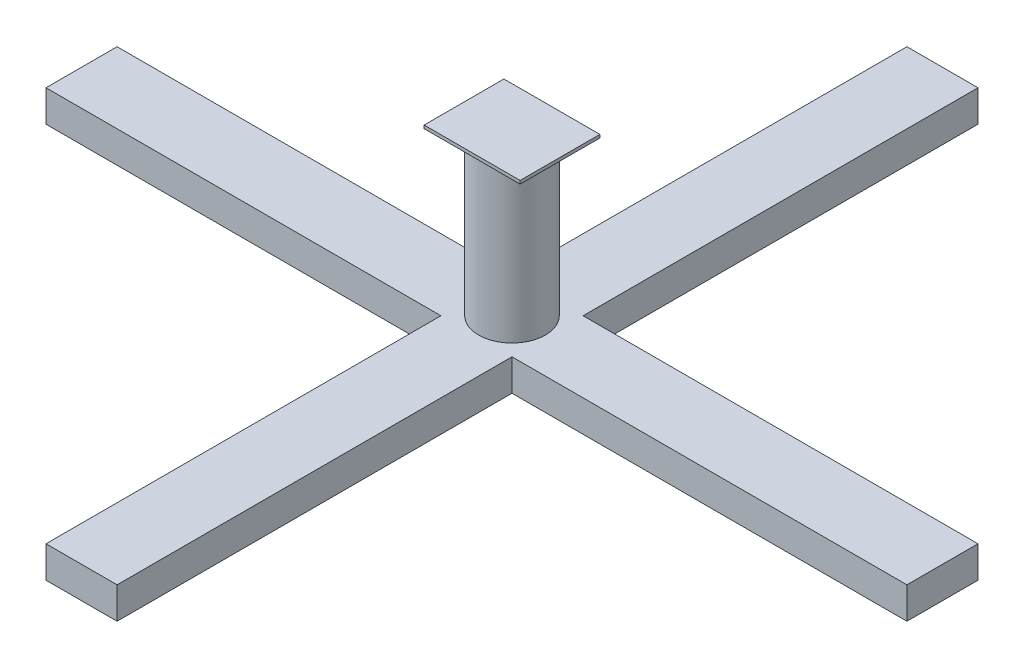
ISO-10303-21;
HEADER;
FILE_DESCRIPTION(('STEP AP214'),'2;1');
FILE_NAME('part.step','',(''),(''),'','','');
FILE_SCHEMA(('AUTOMOTIVE_DESIGN { 1 0 10303 214 1 1 1 1 }'));
ENDSEC;
DATA;
#1=APPLICATION_CONTEXT('core data for automotive mechanical design processes');
#2=APPLICATION_PROTOCOL_DEFINITION('international standard','automotive_design',2000,#1);
#3=PRODUCT_CONTEXT('',#1,'mechanical');
#4=PRODUCT('Part','Part','',(#3));
#5=PRODUCT_RELATED_PRODUCT_CATEGORY('part','',(#4));
#6=PRODUCT_DEFINITION_FORMATION('','',#4);
#7=PRODUCT_DEFINITION_CONTEXT('part definition',#1,'design');
#8=PRODUCT_DEFINITION('design','',#6,#7);
#9=PRODUCT_DEFINITION_SHAPE('','',#8);
#10=(LENGTH_UNIT() NAMED_UNIT(*) SI_UNIT(.MILLI.,.METRE.));
#11=(NAMED_UNIT(*) PLANE_ANGLE_UNIT() SI_UNIT($,.RADIAN.));
#12=(NAMED_UNIT(*) SI_UNIT($,.STERADIAN.) SOLID_ANGLE_UNIT());
#13=UNCERTAINTY_MEASURE_WITH_UNIT(LENGTH_MEASURE(1.E-05),#10,'distance_accuracy_value','');
#14=(GEOMETRIC_REPRESENTATION_CONTEXT(3) GLOBAL_UNCERTAINTY_ASSIGNED_CONTEXT((#13)) GLOBAL_UNIT_ASSIGNED_CONTEXT((#10,
#11,#12)) REPRESENTATION_CONTEXT('',''));
#15=CARTESIAN_POINT('',(0.,0.,0.));
#16=DIRECTION('',(0.,0.,1.));
#17=DIRECTION('',(1.,0.,0.));
#18=AXIS2_PLACEMENT_3D('',#15,#16,#17);
#19=CARTESIAN_POINT('',(-545.,40.,0.));
#20=DIRECTION('',(-1.,0.,0.));
#21=DIRECTION('',(0.,0.,1.));
#22=AXIS2_PLACEMENT_3D('',#19,#20,#21);
#23=PLANE('',#22);
#24=DIRECTION('',(0.,0.,-1.));
#25=VECTOR('',#24,1.);
#26=CARTESIAN_POINT('',(-545.,0.,0.));
#27=LINE('',#26,#25);
#28=CARTESIAN_POINT('',(-545.,0.,45.));
#29=VERTEX_POINT('',#28);
#30=CARTESIAN_POINT('',(-545.,0.,-45.));
#31=VERTEX_POINT('',#30);
#32=EDGE_CURVE('E172',#29,#31,#27,.T.);
#33=ORIENTED_EDGE('',*,*,#32,.F.);
#34=DIRECTION('',(0.,-1.,0.));
#35=VECTOR('',#34,1.);
#36=CARTESIAN_POINT('',(-545.,40.,45.));
#37=LINE('',#36,#35);
#38=CARTESIAN_POINT('',(-545.,40.,45.));
#39=VERTEX_POINT('',#38);
#40=EDGE_CURVE('E112',#39,#29,#37,.T.);
#41=ORIENTED_EDGE('',*,*,#40,.F.);
#42=DIRECTION('',(0.,0.,-1.));
#43=VECTOR('',#42,1.);
#44=CARTESIAN_POINT('',(-545.,40.,0.));
#45=LINE('',#44,#43);
#46=CARTESIAN_POINT('',(-545.,40.,-45.));
#47=VERTEX_POINT('',#46);
#48=EDGE_CURVE('E215',#39,#47,#45,.T.);
#49=ORIENTED_EDGE('',*,*,#48,.T.);
#50=DIRECTION('',(0.,-1.,0.));
#51=VECTOR('',#50,1.);
#52=CARTESIAN_POINT('',(-545.,40.,-45.));
#53=LINE('',#52,#51);
#54=EDGE_CURVE('E108',#47,#31,#53,.T.);
#55=ORIENTED_EDGE('',*,*,#54,.T.);
#56=EDGE_LOOP('',(#33,#41,#49,#55));
#57=FACE_BOUND('',#56,.T.);
#58=ADVANCED_FACE('F42',(#57),#23,.T.);
#59=CARTESIAN_POINT('',(0.,40.,45.));
#60=DIRECTION('',(0.,0.,1.));
#61=DIRECTION('',(1.,0.,0.));
#62=AXIS2_PLACEMENT_3D('',#59,#60,#61);
#63=PLANE('',#62);
#64=DIRECTION('',(-1.,0.,0.));
#65=VECTOR('',#64,1.);
#66=CARTESIAN_POINT('',(0.,0.,45.));
#67=LINE('',#66,#65);
#68=CARTESIAN_POINT('',(-45.,0.,45.));
#69=VERTEX_POINT('',#68);
#70=EDGE_CURVE('E176',#69,#29,#67,.T.);
#71=ORIENTED_EDGE('',*,*,#70,.F.);
#72=DIRECTION('',(0.,-1.,0.));
#73=VECTOR('',#72,1.);
#74=CARTESIAN_POINT('',(-45.,40.,45.));
#75=LINE('',#74,#73);
#76=CARTESIAN_POINT('',(-45.,40.,45.));
#77=VERTEX_POINT('',#76);
#78=EDGE_CURVE('E241',#77,#69,#75,.T.);
#79=ORIENTED_EDGE('',*,*,#78,.F.);
#80=DIRECTION('',(-1.,0.,0.));
#81=VECTOR('',#80,1.);
#82=CARTESIAN_POINT('',(0.,40.,45.));
#83=LINE('',#82,#81);
#84=EDGE_CURVE('E332',#77,#39,#83,.T.);
#85=ORIENTED_EDGE('',*,*,#84,.T.);
#86=ORIENTED_EDGE('',*,*,#40,.T.);
#87=EDGE_LOOP('',(#71,#79,#85,#86));
#88=FACE_BOUND('',#87,.T.);
#89=ADVANCED_FACE('F313',(#88),#63,.T.);
#90=CARTESIAN_POINT('',(-45.,40.,0.));
#91=DIRECTION('',(1.,0.,0.));
#92=DIRECTION('',(0.,0.,-1.));
#93=AXIS2_PLACEMENT_3D('',#90,#91,#92);
#94=PLANE('',#93);
#95=DIRECTION('',(0.,0.,1.));
#96=VECTOR('',#95,1.);
#97=CARTESIAN_POINT('',(-45.,0.,0.));
#98=LINE('',#97,#96);
#99=CARTESIAN_POINT('',(-45.,0.,545.));
#100=VERTEX_POINT('',#99);
#101=EDGE_CURVE('E181',#69,#100,#98,.T.);
#102=ORIENTED_EDGE('',*,*,#101,.T.);
#103=DIRECTION('',(0.,-1.,0.));
#104=VECTOR('',#103,1.);
#105=CARTESIAN_POINT('',(-45.,40.,545.));
#106=LINE('',#105,#104);
#107=CARTESIAN_POINT('',(-45.,40.,545.));
#108=VERTEX_POINT('',#107);
#109=EDGE_CURVE('E238',#108,#100,#106,.T.);
#110=ORIENTED_EDGE('',*,*,#109,.F.);
#111=DIRECTION('',(0.,0.,1.));
#112=VECTOR('',#111,1.);
#113=CARTESIAN_POINT('',(-45.,40.,0.));
#114=LINE('',#113,#112);
#115=EDGE_CURVE('E327',#77,#108,#114,.T.);
#116=ORIENTED_EDGE('',*,*,#115,.F.);
#117=ORIENTED_EDGE('',*,*,#78,.T.);
#118=EDGE_LOOP('',(#102,#110,#116,#117));
#119=FACE_BOUND('',#118,.T.);
#120=ADVANCED_FACE('F310',(#119),#94,.F.);
#121=CARTESIAN_POINT('',(0.,40.,545.));
#122=DIRECTION('',(0.,0.,1.));
#123=DIRECTION('',(1.,0.,0.));
#124=AXIS2_PLACEMENT_3D('',#121,#122,#123);
#125=PLANE('',#124);
#126=DIRECTION('',(-1.,0.,0.));
#127=VECTOR('',#126,1.);
#128=CARTESIAN_POINT('',(0.,0.,545.));
#129=LINE('',#128,#127);
#130=CARTESIAN_POINT('',(45.,0.,545.));
#131=VERTEX_POINT('',#130);
#132=EDGE_CURVE('E185',#131,#100,#129,.T.);
#133=ORIENTED_EDGE('',*,*,#132,.F.);
#134=DIRECTION('',(0.,-1.,0.));
#135=VECTOR('',#134,1.);
#136=CARTESIAN_POINT('',(45.,40.,545.));
#137=LINE('',#136,#135);
#138=CARTESIAN_POINT('',(45.,40.,545.));
#139=VERTEX_POINT('',#138);
#140=EDGE_CURVE('E235',#139,#131,#137,.T.);
#141=ORIENTED_EDGE('',*,*,#140,.F.);
#142=DIRECTION('',(-1.,0.,0.));
#143=VECTOR('',#142,1.);
#144=CARTESIAN_POINT('',(0.,40.,545.));
#145=LINE('',#144,#143);
#146=EDGE_CURVE('E331',#139,#108,#145,.T.);
#147=ORIENTED_EDGE('',*,*,#146,.T.);
#148=ORIENTED_EDGE('',*,*,#109,.T.);
#149=EDGE_LOOP('',(#133,#141,#147,#148));
#150=FACE_BOUND('',#149,.T.);
#151=ADVANCED_FACE('F306',(#150),#125,.T.);
#152=CARTESIAN_POINT('',(45.,40.,0.));
#153=DIRECTION('',(1.,0.,0.));
#154=DIRECTION('',(0.,0.,-1.));
#155=AXIS2_PLACEMENT_3D('',#152,#153,#154);
#156=PLANE('',#155);
#157=DIRECTION('',(0.,0.,1.));
#158=VECTOR('',#157,1.);
#159=CARTESIAN_POINT('',(45.,0.,0.));
#160=LINE('',#159,#158);
#161=CARTESIAN_POINT('',(45.,0.,45.));
#162=VERTEX_POINT('',#161);
#163=EDGE_CURVE('E189',#162,#131,#160,.T.);
#164=ORIENTED_EDGE('',*,*,#163,.F.);
#165=DIRECTION('',(0.,-1.,0.));
#166=VECTOR('',#165,1.);
#167=CARTESIAN_POINT('',(45.,40.,45.));
#168=LINE('',#167,#166);
#169=CARTESIAN_POINT('',(45.,40.,45.));
#170=VERTEX_POINT('',#169);
#171=EDGE_CURVE('E232',#170,#162,#168,.T.);
#172=ORIENTED_EDGE('',*,*,#171,.F.);
#173=DIRECTION('',(0.,0.,1.));
#174=VECTOR('',#173,1.);
#175=CARTESIAN_POINT('',(45.,40.,0.));
#176=LINE('',#175,#174);
#177=EDGE_CURVE('E342',#170,#139,#176,.T.);
#178=ORIENTED_EDGE('',*,*,#177,.T.);
#179=ORIENTED_EDGE('',*,*,#140,.T.);
#180=EDGE_LOOP('',(#164,#172,#178,#179));
#181=FACE_BOUND('',#180,.T.);
#182=ADVANCED_FACE('F302',(#181),#156,.T.);
#183=CARTESIAN_POINT('',(0.,40.,45.));
#184=DIRECTION('',(0.,0.,-1.));
#185=DIRECTION('',(-1.,0.,0.));
#186=AXIS2_PLACEMENT_3D('',#183,#184,#185);
#187=PLANE('',#186);
#188=DIRECTION('',(1.,0.,0.));
#189=VECTOR('',#188,1.);
#190=CARTESIAN_POINT('',(0.,0.,45.));
#191=LINE('',#190,#189);
#192=CARTESIAN_POINT('',(545.,0.,45.));
#193=VERTEX_POINT('',#192);
#194=EDGE_CURVE('E193',#162,#193,#191,.T.);
#195=ORIENTED_EDGE('',*,*,#194,.T.);
#196=DIRECTION('',(0.,-1.,0.));
#197=VECTOR('',#196,1.);
#198=CARTESIAN_POINT('',(545.,40.,45.));
#199=LINE('',#198,#197);
#200=CARTESIAN_POINT('',(545.,40.,45.));
#201=VERTEX_POINT('',#200);
#202=EDGE_CURVE('E228',#201,#193,#199,.T.);
#203=ORIENTED_EDGE('',*,*,#202,.F.);
#204=DIRECTION('',(1.,0.,0.));
#205=VECTOR('',#204,1.);
#206=CARTESIAN_POINT('',(0.,40.,45.));
#207=LINE('',#206,#205);
#208=EDGE_CURVE('E346',#170,#201,#207,.T.);
#209=ORIENTED_EDGE('',*,*,#208,.F.);
#210=ORIENTED_EDGE('',*,*,#171,.T.);
#211=EDGE_LOOP('',(#195,#203,#209,#210));
#212=FACE_BOUND('',#211,.T.);
#213=ADVANCED_FACE('F298',(#212),#187,.F.);
#214=CARTESIAN_POINT('',(545.,40.,0.));
#215=DIRECTION('',(-1.,0.,0.));
#216=DIRECTION('',(0.,0.,1.));
#217=AXIS2_PLACEMENT_3D('',#214,#215,#216);
#218=PLANE('',#217);
#219=DIRECTION('',(0.,0.,-1.));
#220=VECTOR('',#219,1.);
#221=CARTESIAN_POINT('',(545.,0.,0.));
#222=LINE('',#221,#220);
#223=CARTESIAN_POINT('',(545.,0.,-45.));
#224=VERTEX_POINT('',#223);
#225=EDGE_CURVE('E196',#193,#224,#222,.T.);
#226=ORIENTED_EDGE('',*,*,#225,.T.);
#227=DIRECTION('',(0.,-1.,0.));
#228=VECTOR('',#227,1.);
#229=CARTESIAN_POINT('',(545.,40.,-45.));
#230=LINE('',#229,#228);
#231=CARTESIAN_POINT('',(545.,40.,-45.));
#232=VERTEX_POINT('',#231);
#233=EDGE_CURVE('E225',#232,#224,#230,.T.);
#234=ORIENTED_EDGE('',*,*,#233,.F.);
#235=DIRECTION('',(0.,0.,-1.));
#236=VECTOR('',#235,1.);
#237=CARTESIAN_POINT('',(545.,40.,0.));
#238=LINE('',#237,#236);
#239=EDGE_CURVE('E349',#201,#232,#238,.T.);
#240=ORIENTED_EDGE('',*,*,#239,.F.);
#241=ORIENTED_EDGE('',*,*,#202,.T.);
#242=EDGE_LOOP('',(#226,#234,#240,#241));
#243=FACE_BOUND('',#242,.T.);
#244=ADVANCED_FACE('F294',(#243),#218,.F.);
#245=CARTESIAN_POINT('',(0.,40.,-45.));
#246=DIRECTION('',(0.,0.,-1.));
#247=DIRECTION('',(-1.,0.,0.));
#248=AXIS2_PLACEMENT_3D('',#245,#246,#247);
#249=PLANE('',#248);
#250=DIRECTION('',(1.,0.,0.));
#251=VECTOR('',#250,1.);
#252=CARTESIAN_POINT('',(0.,0.,-45.));
#253=LINE('',#252,#251);
#254=CARTESIAN_POINT('',(45.,0.,-45.));
#255=VERTEX_POINT('',#254);
#256=EDGE_CURVE('E200',#255,#224,#253,.T.);
#257=ORIENTED_EDGE('',*,*,#256,.F.);
#258=DIRECTION('',(0.,-1.,0.));
#259=VECTOR('',#258,1.);
#260=CARTESIAN_POINT('',(45.,40.,-45.));
#261=LINE('',#260,#259);
#262=CARTESIAN_POINT('',(45.,40.,-45.));
#263=VERTEX_POINT('',#262);
#264=EDGE_CURVE('E222',#263,#255,#261,.T.);
#265=ORIENTED_EDGE('',*,*,#264,.F.);
#266=DIRECTION('',(1.,0.,0.));
#267=VECTOR('',#266,1.);
#268=CARTESIAN_POINT('',(0.,40.,-45.));
#269=LINE('',#268,#267);
#270=EDGE_CURVE('E352',#263,#232,#269,.T.);
#271=ORIENTED_EDGE('',*,*,#270,.T.);
#272=ORIENTED_EDGE('',*,*,#233,.T.);
#273=EDGE_LOOP('',(#257,#265,#271,#272));
#274=FACE_BOUND('',#273,.T.);
#275=ADVANCED_FACE('F290',(#274),#249,.T.);
#276=CARTESIAN_POINT('',(45.,40.,0.));
#277=DIRECTION('',(-1.,0.,0.));
#278=DIRECTION('',(0.,0.,1.));
#279=AXIS2_PLACEMENT_3D('',#276,#277,#278);
#280=PLANE('',#279);
#281=DIRECTION('',(0.,0.,-1.));
#282=VECTOR('',#281,1.);
#283=CARTESIAN_POINT('',(45.,0.,0.));
#284=LINE('',#283,#282);
#285=CARTESIAN_POINT('',(45.,0.,-545.));
#286=VERTEX_POINT('',#285);
#287=EDGE_CURVE('E204',#255,#286,#284,.T.);
#288=ORIENTED_EDGE('',*,*,#287,.T.);
#289=DIRECTION('',(0.,-1.,0.));
#290=VECTOR('',#289,1.);
#291=CARTESIAN_POINT('',(45.,40.,-545.));
#292=LINE('',#291,#290);
#293=CARTESIAN_POINT('',(45.,40.,-545.));
#294=VERTEX_POINT('',#293);
#295=EDGE_CURVE('E163',#294,#286,#292,.T.);
#296=ORIENTED_EDGE('',*,*,#295,.F.);
#297=DIRECTION('',(0.,0.,-1.));
#298=VECTOR('',#297,1.);
#299=CARTESIAN_POINT('',(45.,40.,0.));
#300=LINE('',#299,#298);
#301=EDGE_CURVE('E148',#263,#294,#300,.T.);
#302=ORIENTED_EDGE('',*,*,#301,.F.);
#303=ORIENTED_EDGE('',*,*,#264,.T.);
#304=EDGE_LOOP('',(#288,#296,#302,#303));
#305=FACE_BOUND('',#304,.T.);
#306=ADVANCED_FACE('F287',(#305),#280,.F.);
#307=CARTESIAN_POINT('',(0.,40.,-545.));
#308=DIRECTION('',(0.,0.,1.));
#309=DIRECTION('',(1.,0.,0.));
#310=AXIS2_PLACEMENT_3D('',#307,#308,#309);
#311=PLANE('',#310);
#312=DIRECTION('',(-1.,0.,0.));
#313=VECTOR('',#312,1.);
#314=CARTESIAN_POINT('',(0.,0.,-545.));
#315=LINE('',#314,#313);
#316=CARTESIAN_POINT('',(-45.,0.,-545.));
#317=VERTEX_POINT('',#316);
#318=EDGE_CURVE('E158',#286,#317,#315,.T.);
#319=ORIENTED_EDGE('',*,*,#318,.T.);
#320=DIRECTION('',(0.,-1.,0.));
#321=VECTOR('',#320,1.);
#322=CARTESIAN_POINT('',(-45.,40.,-545.));
#323=LINE('',#322,#321);
#324=CARTESIAN_POINT('',(-45.,40.,-545.));
#325=VERTEX_POINT('',#324);
#326=EDGE_CURVE('E155',#325,#317,#323,.T.);
#327=ORIENTED_EDGE('',*,*,#326,.F.);
#328=DIRECTION('',(-1.,0.,0.));
#329=VECTOR('',#328,1.);
#330=CARTESIAN_POINT('',(0.,40.,-545.));
#331=LINE('',#330,#329);
#332=EDGE_CURVE('E141',#294,#325,#331,.T.);
#333=ORIENTED_EDGE('',*,*,#332,.F.);
#334=ORIENTED_EDGE('',*,*,#295,.T.);
#335=EDGE_LOOP('',(#319,#327,#333,#334));
#336=FACE_BOUND('',#335,.T.);
#337=ADVANCED_FACE('F156',(#336),#311,.F.);
#338=CARTESIAN_POINT('',(-45.,40.,0.));
#339=DIRECTION('',(-1.,0.,0.));
#340=DIRECTION('',(0.,0.,1.));
#341=AXIS2_PLACEMENT_3D('',#338,#339,#340);
#342=PLANE('',#341);
#343=DIRECTION('',(0.,0.,-1.));
#344=VECTOR('',#343,1.);
#345=CARTESIAN_POINT('',(-45.,0.,0.));
#346=LINE('',#345,#344);
#347=CARTESIAN_POINT('',(-45.,0.,-45.));
#348=VERTEX_POINT('',#347);
#349=EDGE_CURVE('E209',#348,#317,#346,.T.);
#350=ORIENTED_EDGE('',*,*,#349,.F.);
#351=DIRECTION('',(0.,-1.,0.));
#352=VECTOR('',#351,1.);
#353=CARTESIAN_POINT('',(-45.,40.,-45.));
#354=LINE('',#353,#352);
#355=CARTESIAN_POINT('',(-45.,40.,-45.));
#356=VERTEX_POINT('',#355);
#357=EDGE_CURVE('E101',#356,#348,#354,.T.);
#358=ORIENTED_EDGE('',*,*,#357,.F.);
#359=DIRECTION('',(0.,0.,-1.));
#360=VECTOR('',#359,1.);
#361=CARTESIAN_POINT('',(-45.,40.,0.));
#362=LINE('',#361,#360);
#363=EDGE_CURVE('E145',#356,#325,#362,.T.);
#364=ORIENTED_EDGE('',*,*,#363,.T.);
#365=ORIENTED_EDGE('',*,*,#326,.T.);
#366=EDGE_LOOP('',(#350,#358,#364,#365));
#367=FACE_BOUND('',#366,.T.);
#368=ADVANCED_FACE('F165',(#367),#342,.T.);
#369=CARTESIAN_POINT('',(0.,40.,-45.));
#370=DIRECTION('',(0.,0.,1.));
#371=DIRECTION('',(1.,0.,0.));
#372=AXIS2_PLACEMENT_3D('',#369,#370,#371);
#373=PLANE('',#372);
#374=DIRECTION('',(-1.,0.,0.));
#375=VECTOR('',#374,1.);
#376=CARTESIAN_POINT('',(0.,0.,-45.));
#377=LINE('',#376,#375);
#378=EDGE_CURVE('E212',#348,#31,#377,.T.);
#379=ORIENTED_EDGE('',*,*,#378,.T.);
#380=ORIENTED_EDGE('',*,*,#54,.F.);
#381=DIRECTION('',(-1.,0.,0.));
#382=VECTOR('',#381,1.);
#383=CARTESIAN_POINT('',(0.,40.,-45.));
#384=LINE('',#383,#382);
#385=EDGE_CURVE('E60',#356,#47,#384,.T.);
#386=ORIENTED_EDGE('',*,*,#385,.F.);
#387=ORIENTED_EDGE('',*,*,#357,.T.);
#388=EDGE_LOOP('',(#379,#380,#386,#387));
#389=FACE_BOUND('',#388,.T.);
#390=ADVANCED_FACE('F276',(#389),#373,.F.);
#391=CARTESIAN_POINT('',(0.,40.,0.));
#392=DIRECTION('',(0.,1.,0.));
#393=DIRECTION('',(0.,0.,1.));
#394=AXIS2_PLACEMENT_3D('',#391,#392,#393);
#395=PLANE('',#394);
#396=CARTESIAN_POINT('',(0.,40.,0.));
#397=DIRECTION('',(0.,1.,0.));
#398=DIRECTION('',(0.,0.,1.));
#399=AXIS2_PLACEMENT_3D('',#396,#397,#398);
#400=CIRCLE('',#399,42.35);
#401=CARTESIAN_POINT('',(0.,40.,42.35));
#402=VERTEX_POINT('',#401);
#403=EDGE_CURVE('E366',#402,#402,#400,.T.);
#404=ORIENTED_EDGE('',*,*,#403,.F.);
#405=EDGE_LOOP('',(#404));
#406=FACE_BOUND('',#405,.T.);
#407=ORIENTED_EDGE('',*,*,#48,.F.);
#408=ORIENTED_EDGE('',*,*,#84,.F.);
#409=ORIENTED_EDGE('',*,*,#115,.T.);
#410=ORIENTED_EDGE('',*,*,#146,.F.);
#411=ORIENTED_EDGE('',*,*,#177,.F.);
#412=ORIENTED_EDGE('',*,*,#208,.T.);
#413=ORIENTED_EDGE('',*,*,#239,.T.);
#414=ORIENTED_EDGE('',*,*,#270,.F.);
#415=ORIENTED_EDGE('',*,*,#301,.T.);
#416=ORIENTED_EDGE('',*,*,#332,.T.);
#417=ORIENTED_EDGE('',*,*,#363,.F.);
#418=ORIENTED_EDGE('',*,*,#385,.T.);
#419=EDGE_LOOP('',(#407,#408,#409,#410,#411,#412,#413,#414,#415,#416,#417,#418));
#420=FACE_BOUND('',#419,.T.);
#421=ADVANCED_FACE('F143',(#406,#420),#395,.T.);
#422=CARTESIAN_POINT('',(0.,0.,0.));
#423=DIRECTION('',(0.,1.,0.));
#424=DIRECTION('',(0.,0.,1.));
#425=AXIS2_PLACEMENT_3D('',#422,#423,#424);
#426=PLANE('',#425);
#427=ORIENTED_EDGE('',*,*,#32,.T.);
#428=ORIENTED_EDGE('',*,*,#378,.F.);
#429=ORIENTED_EDGE('',*,*,#349,.T.);
#430=ORIENTED_EDGE('',*,*,#318,.F.);
#431=ORIENTED_EDGE('',*,*,#287,.F.);
#432=ORIENTED_EDGE('',*,*,#256,.T.);
#433=ORIENTED_EDGE('',*,*,#225,.F.);
#434=ORIENTED_EDGE('',*,*,#194,.F.);
#435=ORIENTED_EDGE('',*,*,#163,.T.);
#436=ORIENTED_EDGE('',*,*,#132,.T.);
#437=ORIENTED_EDGE('',*,*,#101,.F.);
#438=ORIENTED_EDGE('',*,*,#70,.T.);
#439=EDGE_LOOP('',(#427,#428,#429,#430,#431,#432,#433,#434,#435,#436,#437,#438));
#440=FACE_BOUND('',#439,.T.);
#441=ADVANCED_FACE('F272',(#440),#426,.F.);
#442=CARTESIAN_POINT('',(0.,240.,0.));
#443=DIRECTION('',(0.,-1.,0.));
#444=DIRECTION('',(0.,0.,-1.));
#445=AXIS2_PLACEMENT_3D('',#442,#443,#444);
#446=CYLINDRICAL_SURFACE('',#445,42.35);
#447=CARTESIAN_POINT('',(0.,240.,0.));
#448=DIRECTION('',(0.,1.,0.));
#449=DIRECTION('',(0.,0.,1.));
#450=AXIS2_PLACEMENT_3D('',#447,#448,#449);
#451=CIRCLE('',#450,42.35);
#452=CARTESIAN_POINT('',(0.,240.,42.35));
#453=VERTEX_POINT('',#452);
#454=EDGE_CURVE('E177',#453,#453,#451,.T.);
#455=ORIENTED_EDGE('',*,*,#454,.F.);
#456=EDGE_LOOP('',(#455));
#457=FACE_BOUND('',#456,.T.);
#458=ORIENTED_EDGE('',*,*,#403,.T.);
#459=EDGE_LOOP('',(#458));
#460=FACE_BOUND('',#459,.T.);
#461=ADVANCED_FACE('F268',(#457,#460),#446,.T.);
#462=CARTESIAN_POINT('',(60.75,244.,50.5));
#463=DIRECTION('',(-1.,0.,0.));
#464=DIRECTION('',(0.,0.,1.));
#465=AXIS2_PLACEMENT_3D('',#462,#463,#464);
#466=PLANE('',#465);
#467=DIRECTION('',(0.,0.,-1.));
#468=VECTOR('',#467,1.);
#469=CARTESIAN_POINT('',(60.75,240.,50.5));
#470=LINE('',#469,#468);
#471=CARTESIAN_POINT('',(60.75,240.,50.5));
#472=VERTEX_POINT('',#471);
#473=CARTESIAN_POINT('',(60.75,240.,-50.5));
#474=VERTEX_POINT('',#473);
#475=EDGE_CURVE('E403',#472,#474,#470,.T.);
#476=ORIENTED_EDGE('',*,*,#475,.T.);
#477=DIRECTION('',(0.,-1.,0.));
#478=VECTOR('',#477,1.);
#479=CARTESIAN_POINT('',(60.75,244.,-50.5));
#480=LINE('',#479,#478);
#481=CARTESIAN_POINT('',(60.75,244.,-50.5));
#482=VERTEX_POINT('',#481);
#483=EDGE_CURVE('E370',#482,#474,#480,.T.);
#484=ORIENTED_EDGE('',*,*,#483,.F.);
#485=DIRECTION('',(0.,0.,-1.));
#486=VECTOR('',#485,1.);
#487=CARTESIAN_POINT('',(60.75,244.,50.5));
#488=LINE('',#487,#486);
#489=CARTESIAN_POINT('',(60.75,244.,50.5));
#490=VERTEX_POINT('',#489);
#491=EDGE_CURVE('E394',#490,#482,#488,.T.);
#492=ORIENTED_EDGE('',*,*,#491,.F.);
#493=DIRECTION('',(0.,-1.,0.));
#494=VECTOR('',#493,1.);
#495=CARTESIAN_POINT('',(60.75,244.,50.5));
#496=LINE('',#495,#494);
#497=EDGE_CURVE('E385',#490,#472,#496,.T.);
#498=ORIENTED_EDGE('',*,*,#497,.T.);
#499=EDGE_LOOP('',(#476,#484,#492,#498));
#500=FACE_BOUND('',#499,.T.);
#501=ADVANCED_FACE('F271',(#500),#466,.F.);
#502=CARTESIAN_POINT('',(-60.75,244.,-50.5));
#503=DIRECTION('',(0.,0.,1.));
#504=DIRECTION('',(1.,0.,0.));
#505=AXIS2_PLACEMENT_3D('',#502,#503,#504);
#506=PLANE('',#505);
#507=DIRECTION('',(-1.,0.,0.));
#508=VECTOR('',#507,1.);
#509=CARTESIAN_POINT('',(-60.75,240.,-50.5));
#510=LINE('',#509,#508);
#511=CARTESIAN_POINT('',(-60.75,240.,-50.5));
#512=VERTEX_POINT('',#511);
#513=EDGE_CURVE('E399',#474,#512,#510,.T.);
#514=ORIENTED_EDGE('',*,*,#513,.T.);
#515=DIRECTION('',(0.,-1.,0.));
#516=VECTOR('',#515,1.);
#517=CARTESIAN_POINT('',(-60.75,244.,-50.5));
#518=LINE('',#517,#516);
#519=CARTESIAN_POINT('',(-60.75,244.,-50.5));
#520=VERTEX_POINT('',#519);
#521=EDGE_CURVE('E377',#520,#512,#518,.T.);
#522=ORIENTED_EDGE('',*,*,#521,.F.);
#523=DIRECTION('',(-1.,0.,0.));
#524=VECTOR('',#523,1.);
#525=CARTESIAN_POINT('',(-60.75,244.,-50.5));
#526=LINE('',#525,#524);
#527=EDGE_CURVE('E414',#482,#520,#526,.T.);
#528=ORIENTED_EDGE('',*,*,#527,.F.);
#529=ORIENTED_EDGE('',*,*,#483,.T.);
#530=EDGE_LOOP('',(#514,#522,#528,#529));
#531=FACE_BOUND('',#530,.T.);
#532=ADVANCED_FACE('F434',(#531),#506,.F.);
#533=CARTESIAN_POINT('',(-60.75,244.,50.5));
#534=DIRECTION('',(1.,0.,0.));
#535=DIRECTION('',(0.,0.,-1.));
#536=AXIS2_PLACEMENT_3D('',#533,#534,#535);
#537=PLANE('',#536);
#538=DIRECTION('',(0.,0.,1.));
#539=VECTOR('',#538,1.);
#540=CARTESIAN_POINT('',(-60.75,240.,50.5));
#541=LINE('',#540,#539);
#542=CARTESIAN_POINT('',(-60.75,240.,50.5));
#543=VERTEX_POINT('',#542);
#544=EDGE_CURVE('E395',#512,#543,#541,.T.);
#545=ORIENTED_EDGE('',*,*,#544,.T.);
#546=DIRECTION('',(0.,-1.,0.));
#547=VECTOR('',#546,1.);
#548=CARTESIAN_POINT('',(-60.75,244.,50.5));
#549=LINE('',#548,#547);
#550=CARTESIAN_POINT('',(-60.75,244.,50.5));
#551=VERTEX_POINT('',#550);
#552=EDGE_CURVE('E381',#551,#543,#549,.T.);
#553=ORIENTED_EDGE('',*,*,#552,.F.);
#554=DIRECTION('',(0.,0.,1.));
#555=VECTOR('',#554,1.);
#556=CARTESIAN_POINT('',(-60.75,244.,50.5));
#557=LINE('',#556,#555);
#558=EDGE_CURVE('E410',#520,#551,#557,.T.);
#559=ORIENTED_EDGE('',*,*,#558,.F.);
#560=ORIENTED_EDGE('',*,*,#521,.T.);
#561=EDGE_LOOP('',(#545,#553,#559,#560));
#562=FACE_BOUND('',#561,.T.);
#563=ADVANCED_FACE('F455',(#562),#537,.F.);
#564=CARTESIAN_POINT('',(-60.75,244.,50.5));
#565=DIRECTION('',(0.,0.,-1.));
#566=DIRECTION('',(-1.,0.,0.));
#567=AXIS2_PLACEMENT_3D('',#564,#565,#566);
#568=PLANE('',#567);
#569=DIRECTION('',(1.,0.,0.));
#570=VECTOR('',#569,1.);
#571=CARTESIAN_POINT('',(-60.75,240.,50.5));
#572=LINE('',#571,#570);
#573=EDGE_CURVE('E390',#543,#472,#572,.T.);
#574=ORIENTED_EDGE('',*,*,#573,.T.);
#575=ORIENTED_EDGE('',*,*,#497,.F.);
#576=DIRECTION('',(1.,0.,0.));
#577=VECTOR('',#576,1.);
#578=CARTESIAN_POINT('',(-60.75,244.,50.5));
#579=LINE('',#578,#577);
#580=EDGE_CURVE('E389',#551,#490,#579,.T.);
#581=ORIENTED_EDGE('',*,*,#580,.F.);
#582=ORIENTED_EDGE('',*,*,#552,.T.);
#583=EDGE_LOOP('',(#574,#575,#581,#582));
#584=FACE_BOUND('',#583,.T.);
#585=ADVANCED_FACE('F448',(#584),#568,.F.);
#586=CARTESIAN_POINT('',(0.,240.,0.));
#587=DIRECTION('',(0.,-1.,0.));
#588=DIRECTION('',(0.,0.,-1.));
#589=AXIS2_PLACEMENT_3D('',#586,#587,#588);
#590=PLANE('',#589);
#591=ORIENTED_EDGE('',*,*,#454,.T.);
#592=EDGE_LOOP('',(#591));
#593=FACE_BOUND('',#592,.T.);
#594=ORIENTED_EDGE('',*,*,#475,.F.);
#595=ORIENTED_EDGE('',*,*,#573,.F.);
#596=ORIENTED_EDGE('',*,*,#544,.F.);
#597=ORIENTED_EDGE('',*,*,#513,.F.);
#598=EDGE_LOOP('',(#594,#595,#596,#597));
#599=FACE_BOUND('',#598,.T.);
#600=ADVANCED_FACE('F264',(#593,#599),#590,.T.);
#601=CARTESIAN_POINT('',(0.,244.,0.));
#602=DIRECTION('',(0.,1.,0.));
#603=DIRECTION('',(0.,0.,1.));
#604=AXIS2_PLACEMENT_3D('',#601,#602,#603);
#605=PLANE('',#604);
#606=ORIENTED_EDGE('',*,*,#491,.T.);
#607=ORIENTED_EDGE('',*,*,#527,.T.);
#608=ORIENTED_EDGE('',*,*,#558,.T.);
#609=ORIENTED_EDGE('',*,*,#580,.T.);
#610=EDGE_LOOP('',(#606,#607,#608,#609));
#611=FACE_BOUND('',#610,.T.);
#612=ADVANCED_FACE('F267',(#611),#605,.T.);
#613=CLOSED_SHELL('',(#58,#89,#120,#151,#182,#213,#244,#275,#306,#337,#368,#390,#421,#441,#461,
#501,#532,#563,#585,#600,#612));
#614=CARTESIAN_POINT('',(0.,240.,0.));
#615=DIRECTION('',(0.,-1.,0.));
#616=DIRECTION('',(0.,0.,-1.));
#617=AXIS2_PLACEMENT_3D('',#614,#615,#616);
#618=CIRCLE('',#617,36.35);
#619=CARTESIAN_POINT('',(0.,240.,-36.35));
#620=VERTEX_POINT('',#619);
#621=EDGE_CURVE('E11',#620,#620,#618,.T.);
#622=ORIENTED_EDGE('',*,*,#621,.T.);
#623=EDGE_LOOP('',(#622));
#624=FACE_BOUND('',#623,.T.);
#625=ADVANCED_FACE('F253',(#624),#590,.T.);
#626=CARTESIAN_POINT('',(0.,40.,0.));
#627=DIRECTION('',(0.,1.,0.));
#628=DIRECTION('',(0.,0.,1.));
#629=AXIS2_PLACEMENT_3D('',#626,#627,#628);
#630=PLANE('',#629);
#631=CARTESIAN_POINT('',(0.,40.,0.));
#632=DIRECTION('',(0.,1.,0.));
#633=DIRECTION('',(0.,0.,1.));
#634=AXIS2_PLACEMENT_3D('',#631,#632,#633);
#635=CIRCLE('',#634,36.35);
#636=CARTESIAN_POINT('',(0.,40.,36.35));
#637=VERTEX_POINT('',#636);
#638=EDGE_CURVE('E52',#637,#637,#635,.F.);
#639=ORIENTED_EDGE('',*,*,#638,.F.);
#640=EDGE_LOOP('',(#639));
#641=FACE_BOUND('',#640,.T.);
#642=ADVANCED_FACE('F251',(#641),#630,.T.);
#643=CARTESIAN_POINT('',(0.,244.,0.));
#644=DIRECTION('',(0.,-1.,0.));
#645=DIRECTION('',(0.,0.,-1.));
#646=AXIS2_PLACEMENT_3D('',#643,#644,#645);
#647=CYLINDRICAL_SURFACE('',#646,36.35);
#648=ORIENTED_EDGE('',*,*,#621,.F.);
#649=EDGE_LOOP('',(#648));
#650=FACE_BOUND('',#649,.T.);
#651=ORIENTED_EDGE('',*,*,#638,.T.);
#652=EDGE_LOOP('',(#651));
#653=FACE_BOUND('',#652,.T.);
#654=ADVANCED_FACE('F249',(#650,#653),#647,.F.);
#655=CLOSED_SHELL('',(#625,#642,#654));
#656=ORIENTED_CLOSED_SHELL('',*,#655,.T.);
#657=BREP_WITH_VOIDS('B2',#613,(#656));
#658=ADVANCED_BREP_SHAPE_REPRESENTATION('',(#18,#657),#14);
#659=SHAPE_DEFINITION_REPRESENTATION(#9,#658);
ENDSEC;
END-ISO-10303-21;
